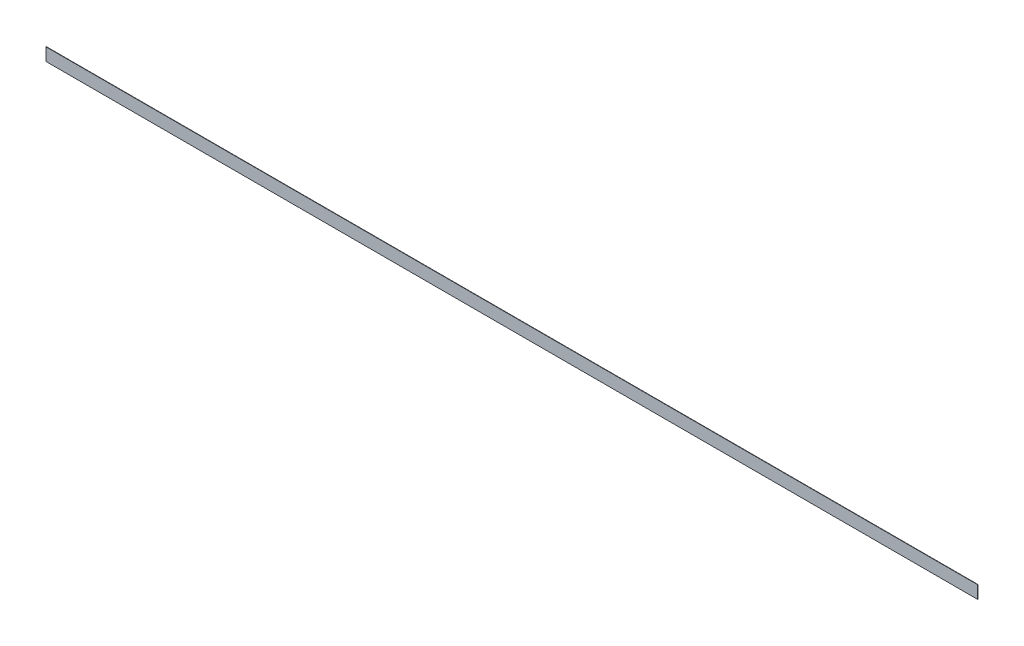
ISO-10303-21;
HEADER;
FILE_DESCRIPTION(('STEP AP214'),'2;1');
FILE_NAME('part.step','',(''),(''),'','','');
FILE_SCHEMA(('AUTOMOTIVE_DESIGN { 1 0 10303 214 1 1 1 1 }'));
ENDSEC;
DATA;
#1=APPLICATION_CONTEXT('core data for automotive mechanical design processes');
#2=APPLICATION_PROTOCOL_DEFINITION('international standard','automotive_design',2000,#1);
#3=PRODUCT_CONTEXT('',#1,'mechanical');
#4=PRODUCT('Part','Part','',(#3));
#5=PRODUCT_RELATED_PRODUCT_CATEGORY('part','',(#4));
#6=PRODUCT_DEFINITION_FORMATION('','',#4);
#7=PRODUCT_DEFINITION_CONTEXT('part definition',#1,'design');
#8=PRODUCT_DEFINITION('design','',#6,#7);
#9=PRODUCT_DEFINITION_SHAPE('','',#8);
#10=(LENGTH_UNIT() NAMED_UNIT(*) SI_UNIT(.MILLI.,.METRE.));
#11=(NAMED_UNIT(*) PLANE_ANGLE_UNIT() SI_UNIT($,.RADIAN.));
#12=(NAMED_UNIT(*) SI_UNIT($,.STERADIAN.) SOLID_ANGLE_UNIT());
#13=UNCERTAINTY_MEASURE_WITH_UNIT(LENGTH_MEASURE(1.E-05),#10,'distance_accuracy_value','');
#14=(GEOMETRIC_REPRESENTATION_CONTEXT(3) GLOBAL_UNCERTAINTY_ASSIGNED_CONTEXT((#13)) GLOBAL_UNIT_ASSIGNED_CONTEXT((#10,
#11,#12)) REPRESENTATION_CONTEXT('',''));
#15=CARTESIAN_POINT('',(0.,0.,0.));
#16=DIRECTION('',(0.,0.,1.));
#17=DIRECTION('',(1.,0.,0.));
#18=AXIS2_PLACEMENT_3D('',#15,#16,#17);
#19=CARTESIAN_POINT('',(375.,-5.125,0.3));
#20=DIRECTION('',(-1.,0.,0.));
#21=DIRECTION('',(0.,0.,1.));
#22=AXIS2_PLACEMENT_3D('',#19,#20,#21);
#23=PLANE('',#22);
#24=DIRECTION('',(0.,1.,0.));
#25=VECTOR('',#24,1.);
#26=CARTESIAN_POINT('',(375.,-5.125,0.));
#27=LINE('',#26,#25);
#28=CARTESIAN_POINT('',(375.,-5.125,0.));
#29=VERTEX_POINT('',#28);
#30=CARTESIAN_POINT('',(375.,5.125,0.));
#31=VERTEX_POINT('',#30);
#32=EDGE_CURVE('E119',#29,#31,#27,.T.);
#33=ORIENTED_EDGE('',*,*,#32,.T.);
#34=DIRECTION('',(0.,0.,-1.));
#35=VECTOR('',#34,1.);
#36=CARTESIAN_POINT('',(375.,5.125,0.3));
#37=LINE('',#36,#35);
#38=CARTESIAN_POINT('',(375.,5.125,0.3));
#39=VERTEX_POINT('',#38);
#40=EDGE_CURVE('E11',#39,#31,#37,.T.);
#41=ORIENTED_EDGE('',*,*,#40,.F.);
#42=DIRECTION('',(0.,1.,0.));
#43=VECTOR('',#42,1.);
#44=CARTESIAN_POINT('',(375.,-5.125,0.3));
#45=LINE('',#44,#43);
#46=CARTESIAN_POINT('',(375.,-5.125,0.3));
#47=VERTEX_POINT('',#46);
#48=EDGE_CURVE('E102',#47,#39,#45,.T.);
#49=ORIENTED_EDGE('',*,*,#48,.F.);
#50=DIRECTION('',(0.,0.,-1.));
#51=VECTOR('',#50,1.);
#52=CARTESIAN_POINT('',(375.,-5.125,0.3));
#53=LINE('',#52,#51);
#54=EDGE_CURVE('E115',#47,#29,#53,.T.);
#55=ORIENTED_EDGE('',*,*,#54,.T.);
#56=EDGE_LOOP('',(#33,#41,#49,#55));
#57=FACE_BOUND('',#56,.T.);
#58=ADVANCED_FACE('F42',(#57),#23,.F.);
#59=CARTESIAN_POINT('',(-375.,5.125,0.3));
#60=DIRECTION('',(0.,-1.,0.));
#61=DIRECTION('',(0.,0.,-1.));
#62=AXIS2_PLACEMENT_3D('',#59,#60,#61);
#63=PLANE('',#62);
#64=DIRECTION('',(-1.,0.,0.));
#65=VECTOR('',#64,1.);
#66=CARTESIAN_POINT('',(-375.,5.125,0.));
#67=LINE('',#66,#65);
#68=CARTESIAN_POINT('',(-375.,5.125,0.));
#69=VERTEX_POINT('',#68);
#70=EDGE_CURVE('E107',#31,#69,#67,.T.);
#71=ORIENTED_EDGE('',*,*,#70,.T.);
#72=DIRECTION('',(0.,0.,-1.));
#73=VECTOR('',#72,1.);
#74=CARTESIAN_POINT('',(-375.,5.125,0.3));
#75=LINE('',#74,#73);
#76=CARTESIAN_POINT('',(-375.,5.125,0.3));
#77=VERTEX_POINT('',#76);
#78=EDGE_CURVE('E51',#77,#69,#75,.T.);
#79=ORIENTED_EDGE('',*,*,#78,.F.);
#80=DIRECTION('',(-1.,0.,0.));
#81=VECTOR('',#80,1.);
#82=CARTESIAN_POINT('',(-375.,5.125,0.3));
#83=LINE('',#82,#81);
#84=EDGE_CURVE('E96',#39,#77,#83,.T.);
#85=ORIENTED_EDGE('',*,*,#84,.F.);
#86=ORIENTED_EDGE('',*,*,#40,.T.);
#87=EDGE_LOOP('',(#71,#79,#85,#86));
#88=FACE_BOUND('',#87,.T.);
#89=ADVANCED_FACE('F106',(#88),#63,.F.);
#90=CARTESIAN_POINT('',(-375.,-5.125,0.3));
#91=DIRECTION('',(1.,0.,0.));
#92=DIRECTION('',(0.,0.,-1.));
#93=AXIS2_PLACEMENT_3D('',#90,#91,#92);
#94=PLANE('',#93);
#95=DIRECTION('',(0.,-1.,0.));
#96=VECTOR('',#95,1.);
#97=CARTESIAN_POINT('',(-375.,-5.125,0.));
#98=LINE('',#97,#96);
#99=CARTESIAN_POINT('',(-375.,-5.125,0.));
#100=VERTEX_POINT('',#99);
#101=EDGE_CURVE('E82',#69,#100,#98,.T.);
#102=ORIENTED_EDGE('',*,*,#101,.T.);
#103=DIRECTION('',(0.,0.,-1.));
#104=VECTOR('',#103,1.);
#105=CARTESIAN_POINT('',(-375.,-5.125,0.3));
#106=LINE('',#105,#104);
#107=CARTESIAN_POINT('',(-375.,-5.125,0.3));
#108=VERTEX_POINT('',#107);
#109=EDGE_CURVE('E109',#108,#100,#106,.T.);
#110=ORIENTED_EDGE('',*,*,#109,.F.);
#111=DIRECTION('',(0.,-1.,0.));
#112=VECTOR('',#111,1.);
#113=CARTESIAN_POINT('',(-375.,-5.125,0.3));
#114=LINE('',#113,#112);
#115=EDGE_CURVE('E100',#77,#108,#114,.T.);
#116=ORIENTED_EDGE('',*,*,#115,.F.);
#117=ORIENTED_EDGE('',*,*,#78,.T.);
#118=EDGE_LOOP('',(#102,#110,#116,#117));
#119=FACE_BOUND('',#118,.T.);
#120=ADVANCED_FACE('F110',(#119),#94,.F.);
#121=CARTESIAN_POINT('',(-375.,-5.125,0.3));
#122=DIRECTION('',(0.,1.,0.));
#123=DIRECTION('',(0.,0.,1.));
#124=AXIS2_PLACEMENT_3D('',#121,#122,#123);
#125=PLANE('',#124);
#126=DIRECTION('',(1.,0.,0.));
#127=VECTOR('',#126,1.);
#128=CARTESIAN_POINT('',(-375.,-5.125,0.));
#129=LINE('',#128,#127);
#130=EDGE_CURVE('E89',#100,#29,#129,.T.);
#131=ORIENTED_EDGE('',*,*,#130,.T.);
#132=ORIENTED_EDGE('',*,*,#54,.F.);
#133=DIRECTION('',(1.,0.,0.));
#134=VECTOR('',#133,1.);
#135=CARTESIAN_POINT('',(-375.,-5.125,0.3));
#136=LINE('',#135,#134);
#137=EDGE_CURVE('E61',#108,#47,#136,.T.);
#138=ORIENTED_EDGE('',*,*,#137,.F.);
#139=ORIENTED_EDGE('',*,*,#109,.T.);
#140=EDGE_LOOP('',(#131,#132,#138,#139));
#141=FACE_BOUND('',#140,.T.);
#142=ADVANCED_FACE('F131',(#141),#125,.F.);
#143=CARTESIAN_POINT('',(0.,0.,0.3));
#144=DIRECTION('',(0.,0.,-1.));
#145=DIRECTION('',(-1.,0.,0.));
#146=AXIS2_PLACEMENT_3D('',#143,#144,#145);
#147=PLANE('',#146);
#148=ORIENTED_EDGE('',*,*,#48,.T.);
#149=ORIENTED_EDGE('',*,*,#84,.T.);
#150=ORIENTED_EDGE('',*,*,#115,.T.);
#151=ORIENTED_EDGE('',*,*,#137,.T.);
#152=EDGE_LOOP('',(#148,#149,#150,#151));
#153=FACE_BOUND('',#152,.T.);
#154=ADVANCED_FACE('F98',(#153),#147,.F.);
#155=CARTESIAN_POINT('',(0.,0.,0.));
#156=DIRECTION('',(0.,0.,-1.));
#157=DIRECTION('',(-1.,0.,0.));
#158=AXIS2_PLACEMENT_3D('',#155,#156,#157);
#159=PLANE('',#158);
#160=ORIENTED_EDGE('',*,*,#32,.F.);
#161=ORIENTED_EDGE('',*,*,#130,.F.);
#162=ORIENTED_EDGE('',*,*,#101,.F.);
#163=ORIENTED_EDGE('',*,*,#70,.F.);
#164=EDGE_LOOP('',(#160,#161,#162,#163));
#165=FACE_BOUND('',#164,.T.);
#166=ADVANCED_FACE('F134',(#165),#159,.T.);
#167=CLOSED_SHELL('',(#58,#89,#120,#142,#154,#166));
#168=MANIFOLD_SOLID_BREP('B2',#167);
#169=ADVANCED_BREP_SHAPE_REPRESENTATION('',(#18,#168),#14);
#170=SHAPE_DEFINITION_REPRESENTATION(#9,#169);
ENDSEC;
END-ISO-10303-21;
